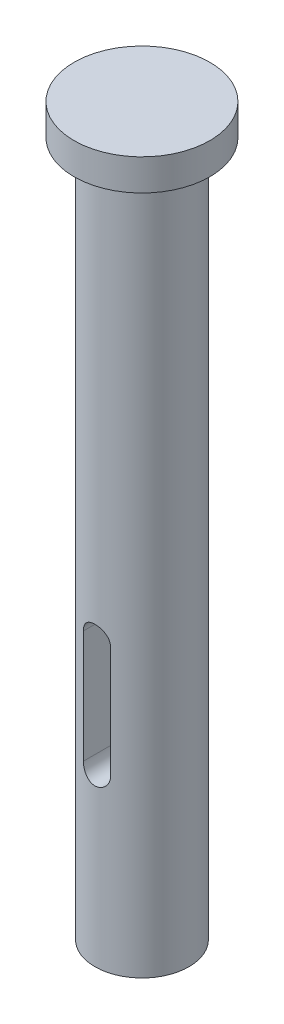
ISO-10303-21;
HEADER;
FILE_DESCRIPTION(('STEP AP214'),'2;1');
FILE_NAME('part.step','',(''),(''),'','','');
FILE_SCHEMA(('AUTOMOTIVE_DESIGN { 1 0 10303 214 1 1 1 1 }'));
ENDSEC;
DATA;
#1=APPLICATION_CONTEXT('core data for automotive mechanical design processes');
#2=APPLICATION_PROTOCOL_DEFINITION('international standard','automotive_design',2000,#1);
#3=PRODUCT_CONTEXT('',#1,'mechanical');
#4=PRODUCT('Part','Part','',(#3));
#5=PRODUCT_RELATED_PRODUCT_CATEGORY('part','',(#4));
#6=PRODUCT_DEFINITION_FORMATION('','',#4);
#7=PRODUCT_DEFINITION_CONTEXT('part definition',#1,'design');
#8=PRODUCT_DEFINITION('design','',#6,#7);
#9=PRODUCT_DEFINITION_SHAPE('','',#8);
#10=(LENGTH_UNIT() NAMED_UNIT(*) SI_UNIT(.MILLI.,.METRE.));
#11=(NAMED_UNIT(*) PLANE_ANGLE_UNIT() SI_UNIT($,.RADIAN.));
#12=(NAMED_UNIT(*) SI_UNIT($,.STERADIAN.) SOLID_ANGLE_UNIT());
#13=UNCERTAINTY_MEASURE_WITH_UNIT(LENGTH_MEASURE(1.E-05),#10,'distance_accuracy_value','');
#14=(GEOMETRIC_REPRESENTATION_CONTEXT(3) GLOBAL_UNCERTAINTY_ASSIGNED_CONTEXT((#13)) GLOBAL_UNIT_ASSIGNED_CONTEXT((#10,
#11,#12)) REPRESENTATION_CONTEXT('',''));
#15=CARTESIAN_POINT('',(0.,0.,0.));
#16=DIRECTION('',(0.,0.,1.));
#17=DIRECTION('',(1.,0.,0.));
#18=AXIS2_PLACEMENT_3D('',#15,#16,#17);
#19=CARTESIAN_POINT('',(0.,176.53,0.));
#20=DIRECTION('',(0.,-1.,0.));
#21=DIRECTION('',(0.,0.,-1.));
#22=AXIS2_PLACEMENT_3D('',#19,#20,#21);
#23=CYLINDRICAL_SURFACE('',#22,11.43);
#24=CARTESIAN_POINT('',(0.,0.,0.));
#25=DIRECTION('',(0.,1.,0.));
#26=DIRECTION('',(0.,0.,1.));
#27=AXIS2_PLACEMENT_3D('',#24,#25,#26);
#28=CIRCLE('',#27,11.43);
#29=CARTESIAN_POINT('',(0.,0.,11.43));
#30=VERTEX_POINT('',#29);
#31=EDGE_CURVE('E155',#30,#30,#28,.T.);
#32=ORIENTED_EDGE('',*,*,#31,.T.);
#33=EDGE_LOOP('',(#32));
#34=FACE_BOUND('',#33,.T.);
#35=DIRECTION('',(0.,-1.,0.));
#36=VECTOR('',#35,1.);
#37=CARTESIAN_POINT('',(3.30199968300475,176.53,10.9426549837522));
#38=LINE('',#37,#36);
#39=CARTESIAN_POINT('',(3.30199968300475,68.8339996695718,10.9426549837522));
#40=VERTEX_POINT('',#39);
#41=CARTESIAN_POINT('',(3.30199968300478,41.402000652588,10.9426549837522));
#42=VERTEX_POINT('',#41);
#43=EDGE_CURVE('E84',#40,#42,#38,.T.);
#44=ORIENTED_EDGE('',*,*,#43,.T.);
#45=CARTESIAN_POINT('',(3.30199968300478,41.402000652588,10.9426549837522));
#46=CARTESIAN_POINT('',(3.30201083959326,41.3112112309869,10.9426429087671));
#47=CARTESIAN_POINT('',(3.2982555000493,41.2204288218974,10.9437845945731));
#48=CARTESIAN_POINT('',(3.28329845120707,41.0395534855812,10.9482858329146));
#49=CARTESIAN_POINT('',(3.27209831420528,40.9494604168329,10.9516449171478));
#50=CARTESIAN_POINT('',(3.24237390580761,40.7708147684955,10.9604807615123));
#51=CARTESIAN_POINT('',(3.22386726106636,40.6822590130391,10.9659524244373));
#52=CARTESIAN_POINT('',(3.17970921283354,40.5071152644384,10.978837580216));
#53=CARTESIAN_POINT('',(3.15405764400974,40.4205273168791,10.9862511180043));
#54=CARTESIAN_POINT('',(3.06669238552717,40.1646642030274,11.0110858179221));
#55=CARTESIAN_POINT('',(2.99453188264708,39.9990741012283,11.0311125369567));
#56=CARTESIAN_POINT('',(2.82460736121545,39.6823585032287,11.0758370133616));
#57=CARTESIAN_POINT('',(2.72683262011485,39.5312391009682,11.1005367257192));
#58=CARTESIAN_POINT('',(2.5053851800656,39.2432786270554,11.1526316818163));
#59=CARTESIAN_POINT('',(2.38109716111844,39.1069195688495,11.1800808566986));
#60=CARTESIAN_POINT('',(2.11147003232109,38.8566620276346,11.2341208915755));
#61=CARTESIAN_POINT('',(1.96612742462546,38.7427672841112,11.2607116080533));
#62=CARTESIAN_POINT('',(1.65509365009165,38.5385901350348,11.3106500088386));
#63=CARTESIAN_POINT('',(1.48906766416632,38.4487987342244,11.333926285317));
#64=CARTESIAN_POINT('',(1.14349509824242,38.2985994154898,11.3739845243319));
#65=CARTESIAN_POINT('',(0.963951818965167,38.2381843510042,11.3907680661922));
#66=CARTESIAN_POINT('',(0.601510727887433,38.1500408390082,11.4155677099243));
#67=CARTESIAN_POINT('',(0.418829686833354,38.1214845278902,11.4238054567622));
#68=CARTESIAN_POINT('',(0.0510924066887413,38.0952559026843,11.4313640511465));
#69=CARTESIAN_POINT('',(-0.13396341304984,38.0975782088518,11.4306864519455));
#70=CARTESIAN_POINT('',(-0.495397591399471,38.1324769811574,11.4206490058453));
#71=CARTESIAN_POINT('',(-0.671870754801768,38.1641571001583,11.4115463996912));
#72=CARTESIAN_POINT('',(-1.01687808512803,38.2554129724509,11.3859913480712));
#73=CARTESIAN_POINT('',(-1.18541184716721,38.3149901467144,11.3695385282148));
#74=CARTESIAN_POINT('',(-1.51194497621491,38.4609845032003,11.3307669774951));
#75=CARTESIAN_POINT('',(-1.66980652361981,38.5476924884333,11.3083851148713));
#76=CARTESIAN_POINT('',(-1.9690292557211,38.7452554529799,11.2601432863006));
#77=CARTESIAN_POINT('',(-2.1103870044902,38.8561154467828,11.2342825985002));
#78=CARTESIAN_POINT('',(-2.37793178215076,39.1035212222926,11.1807708066999));
#79=CARTESIAN_POINT('',(-2.50339565956968,39.240843679194,11.1530887472081));
#80=CARTESIAN_POINT('',(-2.72972929794975,39.5348532248857,11.0998661849813));
#81=CARTESIAN_POINT('',(-2.83059204499695,39.6915458170633,11.0743262943487));
#82=CARTESIAN_POINT('',(-3.00558608673521,40.0218475127088,11.0281311836041));
#83=CARTESIAN_POINT('',(-3.07947321999842,40.1955939001078,11.0075211348333));
#84=CARTESIAN_POINT('',(-3.16735344932954,40.4639319406656,10.9824254132337));
#85=CARTESIAN_POINT('',(-3.19281956446442,40.5546493909043,10.9750307749866));
#86=CARTESIAN_POINT('',(-3.23593023283909,40.7380597002294,10.9623978810592));
#87=CARTESIAN_POINT('',(-3.25357840619661,40.8307516241467,10.9571586274028));
#88=CARTESIAN_POINT('',(-3.27880211126455,41.0031792093433,10.9496350189902));
#89=CARTESIAN_POINT('',(-3.28750207364252,41.0827389975838,10.947022239621));
#90=CARTESIAN_POINT('',(-3.29909958616893,41.242196377068,10.943530029869));
#91=CARTESIAN_POINT('',(-3.30200592117769,41.3220932725115,10.9426479752252));
#92=CARTESIAN_POINT('',(-3.30200031699521,41.4020000185976,10.9426547924424));
#93=B_SPLINE_CURVE_WITH_KNOTS('',3,(#45,#46,#47,#48,#49,#50,#51,#52,#53,#54,#55,#56,#57,#58,#59,
#60,#61,#62,#63,#64,#65,#66,#67,#68,#69,#70,#71,#72,#73,#74,#75,#76,#77,#78,#79,#80,#81,#82,#83,
#84,#85,#86,#87,#88,#89,#90,#91,#92),.UNSPECIFIED.,.F.,.F.,(4,2,2,2,2,2,2,2,2,2,2,2,2,2,2,2,2,2,
2,2,2,2,2,4),(0.,0.272271475277364,0.544485466717382,0.816046726822233,1.08761427132711,
1.63010064254452,2.17281447153649,2.72984963807595,3.28697745245674,3.85471570174013,
4.42231576467131,4.9747955768686,5.52717913600924,6.06323414713445,6.59931646587123,
7.14135390825002,7.68350399698141,8.24503882955918,8.80673357207434,9.37339317231377,
9.65663330028748,9.93974213575611,10.1797502575283,10.4193941780254),.UNSPECIFIED.);
#94=CARTESIAN_POINT('',(-3.30200031699524,41.4020000185976,10.9426547924424));
#95=VERTEX_POINT('',#94);
#96=EDGE_CURVE('E115',#42,#95,#93,.T.);
#97=ORIENTED_EDGE('',*,*,#96,.T.);
#98=DIRECTION('',(0.,-1.,0.));
#99=VECTOR('',#98,1.);
#100=CARTESIAN_POINT('',(-3.30200031699528,176.53,10.9426547924424));
#101=LINE('',#100,#99);
#102=CARTESIAN_POINT('',(-3.30200031699528,68.8340003035623,10.9426547924424));
#103=VERTEX_POINT('',#102);
#104=EDGE_CURVE('E114',#95,#103,#101,.F.);
#105=ORIENTED_EDGE('',*,*,#104,.T.);
#106=CARTESIAN_POINT('',(-3.30200031699525,68.8340003035623,10.9426547924424));
#107=CARTESIAN_POINT('',(-3.30201144729442,68.924789726793,10.9426427253901));
#108=CARTESIAN_POINT('',(-3.29825608132859,69.0155721363102,10.9437844194061));
#109=CARTESIAN_POINT('',(-3.28329897963044,69.1964474710653,10.9482856744644));
#110=CARTESIAN_POINT('',(-3.2720988161964,69.2865405378255,10.9516447672037));
#111=CARTESIAN_POINT('',(-3.24237435523471,69.4651861797615,10.9604806285998));
#112=CARTESIAN_POINT('',(-3.22386768436513,69.5537419308112,10.9659523000488));
#113=CARTESIAN_POINT('',(-3.17970958434121,69.7288856683113,10.9788374726768));
#114=CARTESIAN_POINT('',(-3.15405798985411,69.8154736091767,10.9862510187902));
#115=CARTESIAN_POINT('',(-3.06669265546892,70.071336699466,11.0110857430294));
#116=CARTESIAN_POINT('',(-2.9945321033401,70.2369267811046,11.0311124774379));
#117=CARTESIAN_POINT('',(-2.82460748731823,70.5536423311356,11.0758369815945));
#118=CARTESIAN_POINT('',(-2.72683270086809,70.7047617055793,11.1005367063304));
#119=CARTESIAN_POINT('',(-2.50538517177441,70.9927221187622,11.152631684168));
#120=CARTESIAN_POINT('',(-2.38109710884744,71.1290811435535,11.1800808683481));
#121=CARTESIAN_POINT('',(-2.11146989717647,71.3793386107682,11.2341209174904));
#122=CARTESIAN_POINT('',(-1.96612725059407,71.4932333137115,11.2607116389351));
#123=CARTESIAN_POINT('',(-1.65509340784505,71.6974103715153,11.3106500447416));
#124=CARTESIAN_POINT('',(-1.4890673931762,71.7872017221889,11.3339263212909));
#125=CARTESIAN_POINT('',(-1.14349477827941,71.937400936101,11.3739845568681));
#126=CARTESIAN_POINT('',(-0.963951478773006,71.9978159459069,11.3907680952222));
#127=CARTESIAN_POINT('',(-0.601510362396373,72.0859593456628,11.4155677293346));
#128=CARTESIAN_POINT('',(-0.418829316240439,72.114515600151,11.4238054703489));
#129=CARTESIAN_POINT('',(-0.0510920356885665,72.1407441126334,11.4313640528076));
#130=CARTESIAN_POINT('',(0.133963779357426,72.1384217503681,11.4306864475035));
#131=CARTESIAN_POINT('',(0.495397941649401,72.1035228696293,11.4206489905516));
#132=CARTESIAN_POINT('',(0.671871093918111,72.071842697826,11.411546379498));
#133=CARTESIAN_POINT('',(1.01687839375538,71.9805867228353,11.3859913202822));
#134=CARTESIAN_POINT('',(1.18541213643742,71.9210094986717,11.3695384977286));
#135=CARTESIAN_POINT('',(1.51194522348697,71.7750150439461,11.3307669442273));
#136=CARTESIAN_POINT('',(1.66980674784276,71.6883070097286,11.3083850814044));
#137=CARTESIAN_POINT('',(1.96902942636007,71.4907439509167,11.2601432561019));
#138=CARTESIAN_POINT('',(2.11038714459436,71.379883911836,11.2342825717698));
#139=CARTESIAN_POINT('',(2.37793185216544,71.1324780496227,11.1807707913564));
#140=CARTESIAN_POINT('',(2.50339568990812,70.9951555516051,11.1530887399377));
#141=CARTESIAN_POINT('',(2.72972924226731,70.7011459300188,11.0998661982118));
#142=CARTESIAN_POINT('',(2.83059194296474,70.5444533030622,11.0743263200085));
#143=CARTESIAN_POINT('',(3.00558588236282,70.2141515513604,11.0281312388506));
#144=CARTESIAN_POINT('',(3.07947296057822,70.0404051433141,11.0075212070864));
#145=CARTESIAN_POINT('',(3.16735310544411,69.7720670796585,10.9824255123268));
#146=CARTESIAN_POINT('',(3.19281919210369,69.6813496230957,10.9750308832496));
#147=CARTESIAN_POINT('',(3.23592980314593,69.4979393038029,10.9623980078375));
#148=CARTESIAN_POINT('',(3.25357794765006,69.4052473762414,10.9571587635257));
#149=CARTESIAN_POINT('',(3.27880158270072,69.2328199005894,10.9496351772149));
#150=CARTESIAN_POINT('',(3.28750151217978,69.1532602264255,10.9470224082113));
#151=CARTESIAN_POINT('',(3.29909897575359,68.9938030776156,10.9435302138826));
#152=CARTESIAN_POINT('',(3.30200529468888,68.9139062987662,10.942648164303));
#153=CARTESIAN_POINT('',(3.30199968300475,68.8339996695718,10.9426549837522));
#154=B_SPLINE_CURVE_WITH_KNOTS('',3,(#106,#107,#108,#109,#110,#111,#112,#113,#114,#115,#116,
#117,#118,#119,#120,#121,#122,#123,#124,#125,#126,#127,#128,#129,#130,#131,#132,#133,#134,#135,
#136,#137,#138,#139,#140,#141,#142,#143,#144,#145,#146,#147,#148,#149,#150,#151,#152,#153),
.UNSPECIFIED.,.F.,.F.,(4,2,2,2,2,2,2,2,2,2,2,2,2,2,2,2,2,2,2,2,2,2,2,4),(0.,0.272271480130529,
0.544485476356436,0.816046741088104,1.08761429023992,1.63010067014952,2.17281450804256,
2.72984969314372,3.28697752592517,3.85471577933665,4.42231584629946,4.97479564672128,
5.5271791941564,6.06323420127884,6.5993165161007,7.14135396856277,7.68350406732617,
8.24503890682224,8.80673365633091,9.37339324345029,9.65663336449062,9.93974219290005,
10.1797499639468,10.4193935340125),.UNSPECIFIED.);
#155=EDGE_CURVE('E58',#103,#40,#154,.T.);
#156=ORIENTED_EDGE('',*,*,#155,.T.);
#157=EDGE_LOOP('',(#44,#97,#105,#156));
#158=FACE_BOUND('',#157,.T.);
#159=DIRECTION('',(0.,-1.,0.));
#160=VECTOR('',#159,1.);
#161=CARTESIAN_POINT('',(3.30199968300475,176.53,-10.9426549837522));
#162=LINE('',#161,#160);
#163=CARTESIAN_POINT('',(3.30199968300478,41.402000652588,-10.9426549837522));
#164=VERTEX_POINT('',#163);
#165=CARTESIAN_POINT('',(3.30199968300475,68.8339996695718,-10.9426549837522));
#166=VERTEX_POINT('',#165);
#167=EDGE_CURVE('E92',#164,#166,#162,.F.);
#168=ORIENTED_EDGE('',*,*,#167,.T.);
#169=CARTESIAN_POINT('',(3.30199968300475,68.8339996695718,-10.9426549837522));
#170=CARTESIAN_POINT('',(3.30201083073519,68.9247890920399,-10.9426429114403));
#171=CARTESIAN_POINT('',(3.29825548226283,69.0155715015917,-10.9437845999403));
#172=CARTESIAN_POINT('',(3.28329841550615,69.1964468380206,-10.9482858436276));
#173=CARTESIAN_POINT('',(3.27209826951882,69.2865399064195,-10.9516449305123));
#174=CARTESIAN_POINT('',(3.24237384319298,69.465185553258,-10.9604807800484));
#175=CARTESIAN_POINT('',(3.22386718950899,69.553741307567,-10.9659524454935));
#176=CARTESIAN_POINT('',(3.17970912348641,69.7288850530991,-10.9788376061123));
#177=CARTESIAN_POINT('',(3.15405754581543,69.8154729987373,-10.9862511462204));
#178=CARTESIAN_POINT('',(3.06669226105567,70.0713361056571,-11.0110858526867));
#179=CARTESIAN_POINT('',(2.99453174097964,70.2369262013258,-11.0311125755484));
#180=CARTESIAN_POINT('',(2.82460718619827,70.5536417843825,-11.0758370581298));
#181=CARTESIAN_POINT('',(2.7268324289426,70.7047611778284,-11.1005367728366));
#182=CARTESIAN_POINT('',(2.50538495720314,70.9927216317658,-11.1526317320478));
#183=CARTESIAN_POINT('',(2.38109692269274,71.1290806786952,-11.1800809076552));
#184=CARTESIAN_POINT('',(2.11146976440193,71.3793381947775,-11.2341209421076));
#185=CARTESIAN_POINT('',(1.96612714277887,71.493232924447,-11.2607116574356));
#186=CARTESIAN_POINT('',(1.6550933443862,71.6974100416658,-11.3106500537196));
#187=CARTESIAN_POINT('',(1.48906734881658,71.7872014247872,-11.3339263268644));
#188=CARTESIAN_POINT('',(1.14349476672232,71.937400706667,-11.3739845577771));
#189=CARTESIAN_POINT('',(0.963951480919176,71.9978157519892,-11.3907680948697));
#190=CARTESIAN_POINT('',(0.601510382337663,72.0859592247986,-11.4155677281703));
#191=CARTESIAN_POINT('',(0.418829340294097,72.1145155162299,-11.423805469452));
#192=CARTESIAN_POINT('',(0.0510920617338999,72.1407441025255,-11.4313640526744));
#193=CARTESIAN_POINT('',(-0.133963755431558,72.1384217771322,-11.4306864478671));
#194=CARTESIAN_POINT('',(-0.495397926945173,72.1035229679554,-11.4206489912522));
#195=CARTESIAN_POINT('',(-0.671871086155515,72.0718428310273,-11.4115463801018));
#196=CARTESIAN_POINT('',(-1.01687840522501,71.9805869240479,-11.3859913194038));
#197=CARTESIAN_POINT('',(-1.18541216019845,71.921009733022,-11.3695384954651));
#198=CARTESIAN_POINT('',(-1.51194527477387,71.7750153433962,-11.330766937573));
#199=CARTESIAN_POINT('',(-1.66980681457527,71.6883073414452,-11.3083850717959));
#200=CARTESIAN_POINT('',(-1.96902952886276,71.4907443446798,-11.2601432384239));
#201=CARTESIAN_POINT('',(-2.11038726742264,71.3798843353786,-11.234282548976));
#202=CARTESIAN_POINT('',(-2.3779320218258,71.1324785298786,-11.1807707555835));
#203=CARTESIAN_POINT('',(-2.5033958861174,70.9951560585477,-11.1530886962099));
#204=CARTESIAN_POINT('',(-2.72972949589951,70.7011464859126,-11.0998661361524));
#205=CARTESIAN_POINT('',(-2.8305922274661,70.5444538812144,-11.0743262475722));
#206=CARTESIAN_POINT('',(-3.00558623457767,70.2141521652654,-11.0281311431614));
#207=CARTESIAN_POINT('',(-3.07947334907537,70.0404057703306,-11.0075210986145));
#208=CARTESIAN_POINT('',(-3.16735354947198,69.7720677211748,-10.9824253843238));
#209=CARTESIAN_POINT('',(-3.19281965482178,69.681350268594,-10.9750307486783));
#210=CARTESIAN_POINT('',(-3.23593030346268,69.4979399554897,-10.9623978601922));
#211=CARTESIAN_POINT('',(-3.2535784668753,69.4052480301355,-10.9571586093745));
#212=CARTESIAN_POINT('',(-3.27880213737385,69.2328205535904,-10.9496350111408));
#213=CARTESIAN_POINT('',(-3.28750208314862,69.1532608765433,-10.9470222367531));
#214=CARTESIAN_POINT('',(-3.29909957871151,68.9938037206394,-10.9435300321205));
#215=CARTESIAN_POINT('',(-3.30200591333904,68.913906937581,-10.9426479776208));
#216=CARTESIAN_POINT('',(-3.30200031699525,68.8340003035623,-10.9426547924424));
#217=B_SPLINE_CURVE_WITH_KNOTS('',3,(#169,#170,#171,#172,#173,#174,#175,#176,#177,#178,#179,
#180,#181,#182,#183,#184,#185,#186,#187,#188,#189,#190,#191,#192,#193,#194,#195,#196,#197,#198,
#199,#200,#201,#202,#203,#204,#205,#206,#207,#208,#209,#210,#211,#212,#213,#214,#215,#216),
.UNSPECIFIED.,.F.,.F.,(4,2,2,2,2,2,2,2,2,2,2,2,2,2,2,2,2,2,2,2,2,2,2,4),(0.,0.272271477867021,
0.544485471878624,0.816046734552174,1.08761428163153,1.63010065783911,2.17281449185959,
2.7298496650183,3.28697748595279,3.85471573416675,4.42231579598986,4.97479560132887,
5.5271791536484,6.06323416272791,6.59931647947068,7.14135392711781,7.68350402106484,
8.24503885884494,8.80673360677574,9.37339320436731,9.6566333305808,9.93974216415526,
10.1797499495887,10.4193935341036),.UNSPECIFIED.);
#218=CARTESIAN_POINT('',(-3.30200031699525,68.8340003035623,-10.9426547924424));
#219=VERTEX_POINT('',#218);
#220=EDGE_CURVE('E43',#166,#219,#217,.T.);
#221=ORIENTED_EDGE('',*,*,#220,.T.);
#222=DIRECTION('',(0.,-1.,0.));
#223=VECTOR('',#222,1.);
#224=CARTESIAN_POINT('',(-3.30200031699528,176.53,-10.9426547924424));
#225=LINE('',#224,#223);
#226=CARTESIAN_POINT('',(-3.30200031699528,41.4020000185976,-10.9426547924424));
#227=VERTEX_POINT('',#226);
#228=EDGE_CURVE('E76',#219,#227,#225,.T.);
#229=ORIENTED_EDGE('',*,*,#228,.T.);
#230=CARTESIAN_POINT('',(-3.30200031699521,41.4020000185976,-10.9426547924424));
#231=CARTESIAN_POINT('',(-3.30201145615243,41.3112105962339,-10.9426427227169));
#232=CARTESIAN_POINT('',(-3.29825609911501,41.2204281871791,-10.9437844140389));
#233=CARTESIAN_POINT('',(-3.2832990153313,41.0395528525366,-10.9482856637514));
#234=CARTESIAN_POINT('',(-3.27209886088282,40.9494597854269,-10.9516447538392));
#235=CARTESIAN_POINT('',(-3.24237441784929,40.7708141419921,-10.9604806100638));
#236=CARTESIAN_POINT('',(-3.22386775592246,40.682258389795,-10.9659522789926));
#237=CARTESIAN_POINT('',(-3.17970967368831,40.5071146492263,-10.9788374467805));
#238=CARTESIAN_POINT('',(-3.15405808804839,40.4205267064398,-10.9862509905741));
#239=CARTESIAN_POINT('',(-3.0666927799404,40.1646636092185,-11.0110857082647));
#240=CARTESIAN_POINT('',(-2.99453224500752,39.9990735214496,-11.0311124388463));
#241=CARTESIAN_POINT('',(-2.8246076623354,39.6823579564757,-11.0758369368263));
#242=CARTESIAN_POINT('',(-2.72683289204034,39.5312385732174,-11.100536659213));
#243=CARTESIAN_POINT('',(-2.50538539463689,39.243278140059,-11.1526316339365));
#244=CARTESIAN_POINT('',(-2.38109734727317,39.1069191039913,-11.1800808173915));
#245=CARTESIAN_POINT('',(-2.11147016509565,38.8566616116439,-11.2341208669583));
#246=CARTESIAN_POINT('',(-1.96612753244067,38.7427668948467,-11.2607115895529));
#247=CARTESIAN_POINT('',(-1.65509371355052,38.5385898051853,-11.3106499998606));
#248=CARTESIAN_POINT('',(-1.48906770852597,38.4487984368227,-11.3339262797434));
#249=CARTESIAN_POINT('',(-1.14349510979954,38.2985991860558,-11.3739845234229));
#250=CARTESIAN_POINT('',(-0.963951816819015,38.2381841570866,-11.3907680665448));
#251=CARTESIAN_POINT('',(-0.601510707946151,38.150040718144,-11.4155677110886));
#252=CARTESIAN_POINT('',(-0.418829662779702,38.121484443969,-11.4238054576591));
#253=CARTESIAN_POINT('',(-0.0510923806434041,38.0952558925763,-11.4313640512797));
#254=CARTESIAN_POINT('',(0.133963436975717,38.0975782356159,-11.4306864515819));
#255=CARTESIAN_POINT('',(0.495397606103717,38.1324770794834,-11.4206490051447));
#256=CARTESIAN_POINT('',(0.671870762564386,38.1641572333596,-11.4115463990874));
#257=CARTESIAN_POINT('',(1.01687807365843,38.2554131736634,-11.3859913489496));
#258=CARTESIAN_POINT('',(1.18541182340621,38.3149903810647,-11.3695385304783));
#259=CARTESIAN_POINT('',(1.51194492492806,38.4609848026503,-11.3307669841494));
#260=CARTESIAN_POINT('',(1.66980645688735,38.5476928201498,-11.3083851244798));
#261=CARTESIAN_POINT('',(1.96902915321848,38.7452558467429,-11.2601433039787));
#262=CARTESIAN_POINT('',(2.11038688166199,38.8561158703252,-11.234282621294));
#263=CARTESIAN_POINT('',(2.37793161249048,39.1035217025483,-11.1807708424728));
#264=CARTESIAN_POINT('',(2.5033954633605,39.2408441861365,-11.1530887909358));
#265=CARTESIAN_POINT('',(2.72972904431766,39.5348537807794,-11.0998662470407));
#266=CARTESIAN_POINT('',(2.8305917604957,39.6915463952154,-11.074326366785));
#267=CARTESIAN_POINT('',(3.00558573452049,40.0218481266136,-11.0281312792932));
#268=CARTESIAN_POINT('',(3.0794728315014,40.1955945271241,-11.0075212433051));
#269=CARTESIAN_POINT('',(3.16735300530183,40.4639325821817,-10.9824255412366));
#270=CARTESIAN_POINT('',(3.19281910174649,40.5546500364025,-10.9750309095579));
#271=CARTESIAN_POINT('',(3.23592973252251,40.738060351916,-10.9623980287045));
#272=CARTESIAN_POINT('',(3.25357788697154,40.8307522780407,-10.9571587815539));
#273=CARTESIAN_POINT('',(3.27880155659158,41.0031798623442,-10.9496351850642));
#274=CARTESIAN_POINT('',(3.28750150267382,41.0827396477016,-10.9470224110791));
#275=CARTESIAN_POINT('',(3.29909898321111,41.2421970200917,-10.9435302116311));
#276=CARTESIAN_POINT('',(3.30200530252761,41.3220939113261,-10.9426481619073));
#277=CARTESIAN_POINT('',(3.30199968300478,41.4020006525879,-10.9426549837522));
#278=B_SPLINE_CURVE_WITH_KNOTS('',3,(#230,#231,#232,#233,#234,#235,#236,#237,#238,#239,#240,
#241,#242,#243,#244,#245,#246,#247,#248,#249,#250,#251,#252,#253,#254,#255,#256,#257,#258,#259,
#260,#261,#262,#263,#264,#265,#266,#267,#268,#269,#270,#271,#272,#273,#274,#275,#276,#277),
.UNSPECIFIED.,.F.,.F.,(4,2,2,2,2,2,2,2,2,2,2,2,2,2,2,2,2,2,2,2,2,2,2,4),(0.,0.272271477540872,
0.544485471195202,0.816046733358177,1.08761427993551,1.6301006548549,2.17281448771944,
2.72984966620136,3.28697749242911,3.85471574691001,4.4223158149809,4.97479562226101,
5.52717917651724,6.06323418568538,6.59931650250126,7.14135394969499,7.68350404324274,
8.24503887753649,8.80673362162951,9.37339321139674,9.65663333419728,9.9397421645009,
10.1797502718864,10.4193941779343),.UNSPECIFIED.);
#279=EDGE_CURVE('E83',#227,#164,#278,.T.);
#280=ORIENTED_EDGE('',*,*,#279,.T.);
#281=EDGE_LOOP('',(#168,#221,#229,#280));
#282=FACE_BOUND('',#281,.T.);
#283=CARTESIAN_POINT('',(0.,168.91,0.));
#284=DIRECTION('',(0.,1.,0.));
#285=DIRECTION('',(0.,0.,1.));
#286=AXIS2_PLACEMENT_3D('',#283,#284,#285);
#287=CIRCLE('',#286,11.43);
#288=CARTESIAN_POINT('',(0.,168.91,11.43));
#289=VERTEX_POINT('',#288);
#290=EDGE_CURVE('E11',#289,#289,#287,.T.);
#291=ORIENTED_EDGE('',*,*,#290,.F.);
#292=EDGE_LOOP('',(#291));
#293=FACE_BOUND('',#292,.T.);
#294=ADVANCED_FACE('F35',(#34,#158,#282,#293),#23,.T.);
#295=CARTESIAN_POINT('',(0.,0.,0.));
#296=DIRECTION('',(0.,1.,0.));
#297=DIRECTION('',(0.,0.,1.));
#298=AXIS2_PLACEMENT_3D('',#295,#296,#297);
#299=PLANE('',#298);
#300=ORIENTED_EDGE('',*,*,#31,.F.);
#301=EDGE_LOOP('',(#300));
#302=FACE_BOUND('',#301,.T.);
#303=ADVANCED_FACE('F104',(#302),#299,.F.);
#304=CARTESIAN_POINT('',(-3.1699524535402E-07,68.834,-62.23));
#305=DIRECTION('',(0.,0.,1.));
#306=DIRECTION('',(1.,0.,0.));
#307=AXIS2_PLACEMENT_3D('',#304,#305,#306);
#308=CYLINDRICAL_SURFACE('',#307,3.30200000000002);
#309=DIRECTION('',(0.,0.,1.));
#310=VECTOR('',#309,1.);
#311=CARTESIAN_POINT('',(-3.30200031699525,68.8340003035623,-62.23));
#312=LINE('',#311,#310);
#313=EDGE_CURVE('E78',#219,#103,#312,.T.);
#314=ORIENTED_EDGE('',*,*,#313,.F.);
#315=ORIENTED_EDGE('',*,*,#220,.F.);
#316=DIRECTION('',(0.,0.,1.));
#317=VECTOR('',#316,1.);
#318=CARTESIAN_POINT('',(3.30199968300475,68.8339996695718,-62.23));
#319=LINE('',#318,#317);
#320=EDGE_CURVE('E158',#166,#40,#319,.T.);
#321=ORIENTED_EDGE('',*,*,#320,.T.);
#322=ORIENTED_EDGE('',*,*,#155,.F.);
#323=EDGE_LOOP('',(#314,#315,#321,#322));
#324=FACE_BOUND('',#323,.T.);
#325=ADVANCED_FACE('F86',(#324),#308,.F.);
#326=CARTESIAN_POINT('',(3.30199968300475,41.402000652588,-62.23));
#327=DIRECTION('',(1.,0.,0.));
#328=DIRECTION('',(0.,1.,0.));
#329=AXIS2_PLACEMENT_3D('',#326,#327,#328);
#330=PLANE('',#329);
#331=ORIENTED_EDGE('',*,*,#320,.F.);
#332=ORIENTED_EDGE('',*,*,#167,.F.);
#333=DIRECTION('',(0.,0.,1.));
#334=VECTOR('',#333,1.);
#335=CARTESIAN_POINT('',(3.30199968300478,41.402000652588,-62.23));
#336=LINE('',#335,#334);
#337=EDGE_CURVE('E160',#164,#42,#336,.T.);
#338=ORIENTED_EDGE('',*,*,#337,.T.);
#339=ORIENTED_EDGE('',*,*,#43,.F.);
#340=EDGE_LOOP('',(#331,#332,#338,#339));
#341=FACE_BOUND('',#340,.T.);
#342=ADVANCED_FACE('F103',(#341),#330,.F.);
#343=CARTESIAN_POINT('',(-3.16995181815868E-07,41.402,-62.23));
#344=DIRECTION('',(0.,0.,1.));
#345=DIRECTION('',(1.,0.,0.));
#346=AXIS2_PLACEMENT_3D('',#343,#344,#345);
#347=CYLINDRICAL_SURFACE('',#346,3.30200000000003);
#348=ORIENTED_EDGE('',*,*,#337,.F.);
#349=ORIENTED_EDGE('',*,*,#279,.F.);
#350=DIRECTION('',(0.,0.,1.));
#351=VECTOR('',#350,1.);
#352=CARTESIAN_POINT('',(-3.30200031699524,41.4020000185976,-62.23));
#353=LINE('',#352,#351);
#354=EDGE_CURVE('E50',#227,#95,#353,.T.);
#355=ORIENTED_EDGE('',*,*,#354,.T.);
#356=ORIENTED_EDGE('',*,*,#96,.F.);
#357=EDGE_LOOP('',(#348,#349,#355,#356));
#358=FACE_BOUND('',#357,.T.);
#359=ADVANCED_FACE('F125',(#358),#347,.F.);
#360=CARTESIAN_POINT('',(-3.30200031699524,41.4020000185976,-62.23));
#361=DIRECTION('',(-1.,0.,0.));
#362=DIRECTION('',(0.,-1.,0.));
#363=AXIS2_PLACEMENT_3D('',#360,#361,#362);
#364=PLANE('',#363);
#365=ORIENTED_EDGE('',*,*,#313,.T.);
#366=ORIENTED_EDGE('',*,*,#104,.F.);
#367=ORIENTED_EDGE('',*,*,#354,.F.);
#368=ORIENTED_EDGE('',*,*,#228,.F.);
#369=EDGE_LOOP('',(#365,#366,#367,#368));
#370=FACE_BOUND('',#369,.T.);
#371=ADVANCED_FACE('F77',(#370),#364,.F.);
#372=CARTESIAN_POINT('',(0.,168.91,0.));
#373=DIRECTION('',(0.,1.,0.));
#374=DIRECTION('',(0.,0.,1.));
#375=AXIS2_PLACEMENT_3D('',#372,#373,#374);
#376=CYLINDRICAL_SURFACE('',#375,16.51);
#377=CARTESIAN_POINT('',(0.,168.91,0.));
#378=DIRECTION('',(0.,1.,0.));
#379=DIRECTION('',(0.,0.,1.));
#380=AXIS2_PLACEMENT_3D('',#377,#378,#379);
#381=CIRCLE('',#380,16.51);
#382=CARTESIAN_POINT('',(0.,168.91,16.51));
#383=VERTEX_POINT('',#382);
#384=EDGE_CURVE('E88',#383,#383,#381,.T.);
#385=CARTESIAN_POINT('',(0.,176.53,0.));
#386=DIRECTION('',(0.,1.,0.));
#387=DIRECTION('',(0.,0.,1.));
#388=AXIS2_PLACEMENT_3D('',#385,#386,#387);
#389=CIRCLE('',#388,16.51);
#390=CARTESIAN_POINT('',(0.,176.53,16.51));
#391=VERTEX_POINT('',#390);
#392=EDGE_CURVE('E164',#391,#391,#389,.T.);
#393=CARTESIAN_POINT('',(0.,168.91,16.51));
#394=CARTESIAN_POINT('',(0.,168.989375,16.51));
#395=CARTESIAN_POINT('',(0.,169.06875,16.51));
#396=CARTESIAN_POINT('',(0.,169.2275,16.51));
#397=CARTESIAN_POINT('',(0.,169.306875,16.51));
#398=CARTESIAN_POINT('',(0.,169.465625,16.51));
#399=CARTESIAN_POINT('',(0.,169.545,16.51));
#400=CARTESIAN_POINT('',(0.,169.70375,16.51));
#401=CARTESIAN_POINT('',(0.,169.783125,16.51));
#402=CARTESIAN_POINT('',(0.,169.941875,16.51));
#403=CARTESIAN_POINT('',(0.,170.02125,16.51));
#404=CARTESIAN_POINT('',(0.,170.18,16.51));
#405=CARTESIAN_POINT('',(0.,170.259375,16.51));
#406=CARTESIAN_POINT('',(0.,170.418125,16.51));
#407=CARTESIAN_POINT('',(0.,170.4975,16.51));
#408=CARTESIAN_POINT('',(0.,170.65625,16.51));
#409=CARTESIAN_POINT('',(0.,170.735625,16.51));
#410=CARTESIAN_POINT('',(0.,170.894375,16.51));
#411=CARTESIAN_POINT('',(0.,170.97375,16.51));
#412=CARTESIAN_POINT('',(0.,171.1325,16.51));
#413=CARTESIAN_POINT('',(0.,171.211875,16.51));
#414=CARTESIAN_POINT('',(0.,171.370625,16.51));
#415=CARTESIAN_POINT('',(0.,171.45,16.51));
#416=CARTESIAN_POINT('',(0.,171.60875,16.51));
#417=CARTESIAN_POINT('',(0.,171.688125,16.51));
#418=CARTESIAN_POINT('',(0.,171.846875,16.51));
#419=CARTESIAN_POINT('',(0.,171.92625,16.51));
#420=CARTESIAN_POINT('',(0.,172.085,16.51));
#421=CARTESIAN_POINT('',(0.,172.164375,16.51));
#422=CARTESIAN_POINT('',(0.,172.323125,16.51));
#423=CARTESIAN_POINT('',(0.,172.4025,16.51));
#424=CARTESIAN_POINT('',(0.,172.56125,16.51));
#425=CARTESIAN_POINT('',(0.,172.640625,16.51));
#426=CARTESIAN_POINT('',(0.,172.799375,16.51));
#427=CARTESIAN_POINT('',(0.,172.87875,16.51));
#428=CARTESIAN_POINT('',(0.,173.0375,16.51));
#429=CARTESIAN_POINT('',(0.,173.116875,16.51));
#430=CARTESIAN_POINT('',(0.,173.275625,16.51));
#431=CARTESIAN_POINT('',(0.,173.355,16.51));
#432=CARTESIAN_POINT('',(0.,173.51375,16.51));
#433=CARTESIAN_POINT('',(0.,173.593125,16.51));
#434=CARTESIAN_POINT('',(0.,173.751875,16.51));
#435=CARTESIAN_POINT('',(0.,173.83125,16.51));
#436=CARTESIAN_POINT('',(0.,173.99,16.51));
#437=CARTESIAN_POINT('',(0.,174.069375,16.51));
#438=CARTESIAN_POINT('',(0.,174.228125,16.51));
#439=CARTESIAN_POINT('',(0.,174.3075,16.51));
#440=CARTESIAN_POINT('',(0.,174.46625,16.51));
#441=CARTESIAN_POINT('',(0.,174.545625,16.51));
#442=CARTESIAN_POINT('',(0.,174.704375,16.51));
#443=CARTESIAN_POINT('',(0.,174.78375,16.51));
#444=CARTESIAN_POINT('',(0.,174.9425,16.51));
#445=CARTESIAN_POINT('',(0.,175.021875,16.51));
#446=CARTESIAN_POINT('',(0.,175.180625,16.51));
#447=CARTESIAN_POINT('',(0.,175.26,16.51));
#448=CARTESIAN_POINT('',(0.,175.41875,16.51));
#449=CARTESIAN_POINT('',(0.,175.498125,16.51));
#450=CARTESIAN_POINT('',(0.,175.656875,16.51));
#451=CARTESIAN_POINT('',(0.,175.73625,16.51));
#452=CARTESIAN_POINT('',(0.,175.895,16.51));
#453=CARTESIAN_POINT('',(0.,175.974375,16.51));
#454=CARTESIAN_POINT('',(0.,176.133125,16.51));
#455=CARTESIAN_POINT('',(0.,176.2125,16.51));
#456=CARTESIAN_POINT('',(0.,176.37125,16.51));
#457=CARTESIAN_POINT('',(0.,176.450625,16.51));
#458=CARTESIAN_POINT('',(0.,176.53,16.51));
#459=B_SPLINE_CURVE_WITH_KNOTS('',3,(#393,#394,#395,#396,#397,#398,#399,#400,#401,#402,#403,
#404,#405,#406,#407,#408,#409,#410,#411,#412,#413,#414,#415,#416,#417,#418,#419,#420,#421,#422,
#423,#424,#425,#426,#427,#428,#429,#430,#431,#432,#433,#434,#435,#436,#437,#438,#439,#440,#441,
#442,#443,#444,#445,#446,#447,#448,#449,#450,#451,#452,#453,#454,#455,#456,#457,#458),
.UNSPECIFIED.,.F.,.F.,(4,2,2,2,2,2,2,2,2,2,2,2,2,2,2,2,2,2,2,2,2,2,2,2,2,2,2,2,2,2,2,2,4),(0.,
0.238125000000006,0.476250000000011,0.714375000000017,0.952500000000023,1.190625,
1.42875000000001,1.66687500000001,1.90500000000002,2.14312500000002,2.38125,2.61937500000001,
2.85750000000001,3.09562500000002,3.33375,3.571875,3.81000000000001,4.04812500000001,
4.28625000000002,4.524375,4.7625,5.00062500000001,5.23875000000001,5.47687499999999,5.715,
5.953125,6.19125000000001,6.42937500000001,6.66749999999999,6.905625,7.14375,7.38187500000001,
7.61999999999999),.UNSPECIFIED.);
#460=EDGE_CURVE('BSEAM134',#383,#391,#459,.T.);
#461=ORIENTED_EDGE('',*,*,#384,.T.);
#462=ORIENTED_EDGE('',*,*,#392,.F.);
#463=ORIENTED_EDGE('',*,*,#460,.T.);
#464=ORIENTED_EDGE('',*,*,#460,.F.);
#465=EDGE_LOOP('',(#461,#463,#462,#464));
#466=FACE_BOUND('',#465,.T.);
#467=ADVANCED_FACE('F134',(#466),#376,.T.);
#468=CARTESIAN_POINT('',(0.,168.91,0.));
#469=DIRECTION('',(0.,1.,0.));
#470=DIRECTION('',(0.,0.,1.));
#471=AXIS2_PLACEMENT_3D('',#468,#469,#470);
#472=PLANE('',#471);
#473=ORIENTED_EDGE('',*,*,#290,.T.);
#474=EDGE_LOOP('',(#473));
#475=FACE_BOUND('',#474,.T.);
#476=ORIENTED_EDGE('',*,*,#384,.F.);
#477=EDGE_LOOP('',(#476));
#478=FACE_BOUND('',#477,.T.);
#479=ADVANCED_FACE('F137',(#475,#478),#472,.F.);
#480=CARTESIAN_POINT('',(0.,176.53,0.));
#481=DIRECTION('',(0.,1.,0.));
#482=DIRECTION('',(0.,0.,1.));
#483=AXIS2_PLACEMENT_3D('',#480,#481,#482);
#484=PLANE('',#483);
#485=ORIENTED_EDGE('',*,*,#392,.T.);
#486=EDGE_LOOP('',(#485));
#487=FACE_BOUND('',#486,.T.);
#488=ADVANCED_FACE('F106',(#487),#484,.T.);
#489=CLOSED_SHELL('',(#294,#303,#325,#342,#359,#371,#467,#479,#488));
#490=MANIFOLD_SOLID_BREP('B2',#489);
#491=ADVANCED_BREP_SHAPE_REPRESENTATION('',(#18,#490),#14);
#492=SHAPE_DEFINITION_REPRESENTATION(#9,#491);
ENDSEC;
END-ISO-10303-21;
